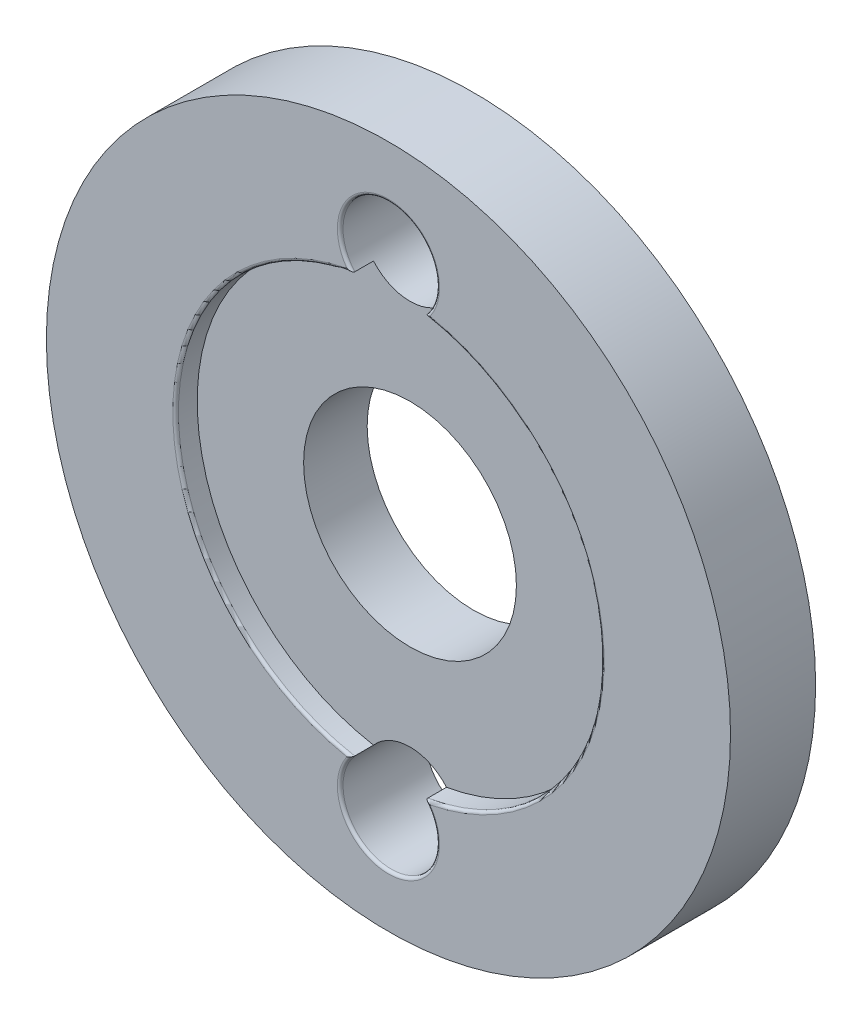
ISO-10303-21;
HEADER;
FILE_DESCRIPTION(('STEP AP214'),'2;1');
FILE_NAME('part.step','',(''),(''),'','','');
FILE_SCHEMA(('AUTOMOTIVE_DESIGN { 1 0 10303 214 1 1 1 1 }'));
ENDSEC;
DATA;
#1=APPLICATION_CONTEXT('core data for automotive mechanical design processes');
#2=APPLICATION_PROTOCOL_DEFINITION('international standard','automotive_design',2000,#1);
#3=PRODUCT_CONTEXT('',#1,'mechanical');
#4=PRODUCT('Part','Part','',(#3));
#5=PRODUCT_RELATED_PRODUCT_CATEGORY('part','',(#4));
#6=PRODUCT_DEFINITION_FORMATION('','',#4);
#7=PRODUCT_DEFINITION_CONTEXT('part definition',#1,'design');
#8=PRODUCT_DEFINITION('design','',#6,#7);
#9=PRODUCT_DEFINITION_SHAPE('','',#8);
#10=(LENGTH_UNIT() NAMED_UNIT(*) SI_UNIT(.MILLI.,.METRE.));
#11=(NAMED_UNIT(*) PLANE_ANGLE_UNIT() SI_UNIT($,.RADIAN.));
#12=(NAMED_UNIT(*) SI_UNIT($,.STERADIAN.) SOLID_ANGLE_UNIT());
#13=UNCERTAINTY_MEASURE_WITH_UNIT(LENGTH_MEASURE(1.E-05),#10,'distance_accuracy_value','');
#14=(GEOMETRIC_REPRESENTATION_CONTEXT(3) GLOBAL_UNCERTAINTY_ASSIGNED_CONTEXT((#13)) GLOBAL_UNIT_ASSIGNED_CONTEXT((#10,
#11,#12)) REPRESENTATION_CONTEXT('',''));
#15=CARTESIAN_POINT('',(0.,0.,0.));
#16=DIRECTION('',(0.,0.,1.));
#17=DIRECTION('',(1.,0.,0.));
#18=AXIS2_PLACEMENT_3D('',#15,#16,#17);
#19=CARTESIAN_POINT('',(0.,8.49999999999995,2.24));
#20=DIRECTION('',(0.,0.,-1.));
#21=DIRECTION('',(-1.,0.,0.));
#22=AXIS2_PLACEMENT_3D('',#19,#20,#21);
#23=CYLINDRICAL_SURFACE('',#22,1.7);
#24=CARTESIAN_POINT('',(0.,8.49999999999995,0.));
#25=DIRECTION('',(0.,0.,1.));
#26=DIRECTION('',(1.,0.,0.));
#27=AXIS2_PLACEMENT_3D('',#24,#25,#26);
#28=CIRCLE('',#27,1.7);
#29=CARTESIAN_POINT('',(1.7,8.49999999999995,0.));
#30=VERTEX_POINT('',#29);
#31=EDGE_CURVE('E133',#30,#30,#28,.T.);
#32=ORIENTED_EDGE('',*,*,#31,.F.);
#33=EDGE_LOOP('',(#32));
#34=FACE_BOUND('',#33,.T.);
#35=DIRECTION('',(0.,0.,-1.));
#36=VECTOR('',#35,1.);
#37=CARTESIAN_POINT('',(1.2865795160856,7.38882352941173,3.));
#38=LINE('',#37,#36);
#39=CARTESIAN_POINT('',(1.2865795160856,7.38882352941173,2.9));
#40=VERTEX_POINT('',#39);
#41=CARTESIAN_POINT('',(1.2865795160856,7.38882352941173,2.24));
#42=VERTEX_POINT('',#41);
#43=EDGE_CURVE('E123',#40,#42,#38,.T.);
#44=ORIENTED_EDGE('',*,*,#43,.F.);
#45=CARTESIAN_POINT('',(0.,8.49999999999995,2.9));
#46=DIRECTION('',(0.,0.,1.));
#47=DIRECTION('',(1.,0.,0.));
#48=AXIS2_PLACEMENT_3D('',#45,#46,#47);
#49=CIRCLE('',#48,1.7);
#50=CARTESIAN_POINT('',(-1.28657951608561,7.38882352941173,2.9));
#51=VERTEX_POINT('',#50);
#52=EDGE_CURVE('E11',#40,#51,#49,.T.);
#53=ORIENTED_EDGE('',*,*,#52,.T.);
#54=DIRECTION('',(0.,0.,-1.));
#55=VECTOR('',#54,1.);
#56=CARTESIAN_POINT('',(-1.28657951608561,7.38882352941173,3.));
#57=LINE('',#56,#55);
#58=CARTESIAN_POINT('',(-1.28657951608561,7.38882352941173,2.24));
#59=VERTEX_POINT('',#58);
#60=EDGE_CURVE('E98',#51,#59,#57,.T.);
#61=ORIENTED_EDGE('',*,*,#60,.T.);
#62=CARTESIAN_POINT('',(0.,8.49999999999995,2.24));
#63=DIRECTION('',(0.,0.,1.));
#64=DIRECTION('',(1.,0.,0.));
#65=AXIS2_PLACEMENT_3D('',#62,#63,#64);
#66=CIRCLE('',#65,1.7);
#67=EDGE_CURVE('E100',#59,#42,#66,.T.);
#68=ORIENTED_EDGE('',*,*,#67,.T.);
#69=EDGE_LOOP('',(#44,#53,#61,#68));
#70=FACE_BOUND('',#69,.T.);
#71=ADVANCED_FACE('F39',(#34,#70),#23,.F.);
#72=CARTESIAN_POINT('',(0.,-8.49999999999995,2.24));
#73=DIRECTION('',(0.,0.,-1.));
#74=DIRECTION('',(-1.,0.,0.));
#75=AXIS2_PLACEMENT_3D('',#72,#73,#74);
#76=CYLINDRICAL_SURFACE('',#75,1.7);
#77=CARTESIAN_POINT('',(0.,-8.49999999999995,0.));
#78=DIRECTION('',(0.,0.,1.));
#79=DIRECTION('',(1.,0.,0.));
#80=AXIS2_PLACEMENT_3D('',#77,#78,#79);
#81=CIRCLE('',#80,1.7);
#82=CARTESIAN_POINT('',(1.7,-8.49999999999995,0.));
#83=VERTEX_POINT('',#82);
#84=EDGE_CURVE('E125',#83,#83,#81,.T.);
#85=ORIENTED_EDGE('',*,*,#84,.F.);
#86=EDGE_LOOP('',(#85));
#87=FACE_BOUND('',#86,.T.);
#88=DIRECTION('',(0.,0.,-1.));
#89=VECTOR('',#88,1.);
#90=CARTESIAN_POINT('',(-1.28657951608561,-7.38882352941173,3.));
#91=LINE('',#90,#89);
#92=CARTESIAN_POINT('',(-1.28657951608561,-7.38882352941173,2.9));
#93=VERTEX_POINT('',#92);
#94=CARTESIAN_POINT('',(-1.28657951608561,-7.38882352941173,2.24));
#95=VERTEX_POINT('',#94);
#96=EDGE_CURVE('E105',#93,#95,#91,.T.);
#97=ORIENTED_EDGE('',*,*,#96,.F.);
#98=CARTESIAN_POINT('',(0.,-8.49999999999995,2.9));
#99=DIRECTION('',(0.,0.,1.));
#100=DIRECTION('',(1.,0.,0.));
#101=AXIS2_PLACEMENT_3D('',#98,#99,#100);
#102=CIRCLE('',#101,1.7);
#103=CARTESIAN_POINT('',(1.2865795160856,-7.38882352941173,2.9));
#104=VERTEX_POINT('',#103);
#105=EDGE_CURVE('E134',#93,#104,#102,.T.);
#106=ORIENTED_EDGE('',*,*,#105,.T.);
#107=DIRECTION('',(0.,0.,-1.));
#108=VECTOR('',#107,1.);
#109=CARTESIAN_POINT('',(1.2865795160856,-7.38882352941173,3.));
#110=LINE('',#109,#108);
#111=CARTESIAN_POINT('',(1.2865795160856,-7.38882352941173,2.24));
#112=VERTEX_POINT('',#111);
#113=EDGE_CURVE('E230',#104,#112,#110,.T.);
#114=ORIENTED_EDGE('',*,*,#113,.T.);
#115=CARTESIAN_POINT('',(0.,-8.49999999999995,2.24));
#116=DIRECTION('',(0.,0.,1.));
#117=DIRECTION('',(1.,0.,0.));
#118=AXIS2_PLACEMENT_3D('',#115,#116,#117);
#119=CIRCLE('',#118,1.7);
#120=EDGE_CURVE('E115',#112,#95,#119,.T.);
#121=ORIENTED_EDGE('',*,*,#120,.T.);
#122=EDGE_LOOP('',(#97,#106,#114,#121));
#123=FACE_BOUND('',#122,.T.);
#124=ADVANCED_FACE('F190',(#87,#123),#76,.F.);
#125=CARTESIAN_POINT('',(0.,0.,2.24));
#126=DIRECTION('',(0.,0.,-1.));
#127=DIRECTION('',(-1.,0.,0.));
#128=AXIS2_PLACEMENT_3D('',#125,#126,#127);
#129=CYLINDRICAL_SURFACE('',#128,3.75);
#130=CARTESIAN_POINT('',(0.,0.,2.24));
#131=DIRECTION('',(0.,0.,1.));
#132=DIRECTION('',(1.,0.,0.));
#133=AXIS2_PLACEMENT_3D('',#130,#131,#132);
#134=CIRCLE('',#133,3.75);
#135=CARTESIAN_POINT('',(3.75,0.,2.24));
#136=VERTEX_POINT('',#135);
#137=EDGE_CURVE('E128',#136,#136,#134,.T.);
#138=ORIENTED_EDGE('',*,*,#137,.T.);
#139=EDGE_LOOP('',(#138));
#140=FACE_BOUND('',#139,.T.);
#141=CARTESIAN_POINT('',(0.,0.,0.));
#142=DIRECTION('',(0.,0.,1.));
#143=DIRECTION('',(1.,0.,0.));
#144=AXIS2_PLACEMENT_3D('',#141,#142,#143);
#145=CIRCLE('',#144,3.75);
#146=CARTESIAN_POINT('',(3.75,0.,0.));
#147=VERTEX_POINT('',#146);
#148=EDGE_CURVE('E118',#147,#147,#145,.T.);
#149=ORIENTED_EDGE('',*,*,#148,.F.);
#150=EDGE_LOOP('',(#149));
#151=FACE_BOUND('',#150,.T.);
#152=ADVANCED_FACE('F194',(#140,#151),#129,.F.);
#153=CARTESIAN_POINT('',(0.,0.,2.24));
#154=DIRECTION('',(0.,0.,1.));
#155=DIRECTION('',(1.,0.,0.));
#156=AXIS2_PLACEMENT_3D('',#153,#154,#155);
#157=PLANE('',#156);
#158=ORIENTED_EDGE('',*,*,#67,.F.);
#159=CARTESIAN_POINT('',(0.,0.,2.24));
#160=DIRECTION('',(0.,0.,1.));
#161=DIRECTION('',(1.,0.,0.));
#162=AXIS2_PLACEMENT_3D('',#159,#160,#161);
#163=CIRCLE('',#162,7.5);
#164=EDGE_CURVE('E106',#59,#95,#163,.T.);
#165=ORIENTED_EDGE('',*,*,#164,.T.);
#166=ORIENTED_EDGE('',*,*,#120,.F.);
#167=CARTESIAN_POINT('',(0.,0.,2.24));
#168=DIRECTION('',(0.,0.,1.));
#169=DIRECTION('',(1.,0.,0.));
#170=AXIS2_PLACEMENT_3D('',#167,#168,#169);
#171=CIRCLE('',#170,7.5);
#172=EDGE_CURVE('E117',#112,#42,#171,.T.);
#173=ORIENTED_EDGE('',*,*,#172,.T.);
#174=EDGE_LOOP('',(#158,#165,#166,#173));
#175=FACE_BOUND('',#174,.T.);
#176=ORIENTED_EDGE('',*,*,#137,.F.);
#177=EDGE_LOOP('',(#176));
#178=FACE_BOUND('',#177,.T.);
#179=ADVANCED_FACE('F114',(#175,#178),#157,.T.);
#180=CARTESIAN_POINT('',(0.,0.,0.));
#181=DIRECTION('',(0.,0.,1.));
#182=DIRECTION('',(1.,0.,0.));
#183=AXIS2_PLACEMENT_3D('',#180,#181,#182);
#184=PLANE('',#183);
#185=ORIENTED_EDGE('',*,*,#84,.T.);
#186=EDGE_LOOP('',(#185));
#187=FACE_BOUND('',#186,.T.);
#188=ORIENTED_EDGE('',*,*,#31,.T.);
#189=EDGE_LOOP('',(#188));
#190=FACE_BOUND('',#189,.T.);
#191=ORIENTED_EDGE('',*,*,#148,.T.);
#192=EDGE_LOOP('',(#191));
#193=FACE_BOUND('',#192,.T.);
#194=CARTESIAN_POINT('',(0.,0.,0.));
#195=DIRECTION('',(0.,0.,1.));
#196=DIRECTION('',(1.,0.,0.));
#197=AXIS2_PLACEMENT_3D('',#194,#195,#196);
#198=CIRCLE('',#197,12.0555555555556);
#199=CARTESIAN_POINT('',(12.0555555555556,0.,0.));
#200=VERTEX_POINT('',#199);
#201=EDGE_CURVE('E221',#200,#200,#198,.T.);
#202=ORIENTED_EDGE('',*,*,#201,.F.);
#203=EDGE_LOOP('',(#202));
#204=FACE_BOUND('',#203,.T.);
#205=ADVANCED_FACE('F202',(#187,#190,#193,#204),#184,.F.);
#206=CARTESIAN_POINT('',(0.,0.,3.));
#207=DIRECTION('',(0.,0.,-1.));
#208=DIRECTION('',(-1.,0.,0.));
#209=AXIS2_PLACEMENT_3D('',#206,#207,#208);
#210=CYLINDRICAL_SURFACE('',#209,7.5);
#211=ORIENTED_EDGE('',*,*,#113,.F.);
#212=CARTESIAN_POINT('',(0.,0.,2.9));
#213=DIRECTION('',(0.,0.,1.));
#214=DIRECTION('',(1.,0.,0.));
#215=AXIS2_PLACEMENT_3D('',#212,#213,#214);
#216=CIRCLE('',#215,7.5);
#217=EDGE_CURVE('E67',#104,#40,#216,.T.);
#218=ORIENTED_EDGE('',*,*,#217,.T.);
#219=ORIENTED_EDGE('',*,*,#43,.T.);
#220=ORIENTED_EDGE('',*,*,#172,.F.);
#221=EDGE_LOOP('',(#211,#218,#219,#220));
#222=FACE_BOUND('',#221,.T.);
#223=ADVANCED_FACE('F201',(#222),#210,.F.);
#224=CARTESIAN_POINT('',(0.,0.,3.));
#225=DIRECTION('',(0.,0.,-1.));
#226=DIRECTION('',(-1.,0.,0.));
#227=AXIS2_PLACEMENT_3D('',#224,#225,#226);
#228=CYLINDRICAL_SURFACE('',#227,7.5);
#229=ORIENTED_EDGE('',*,*,#60,.F.);
#230=CARTESIAN_POINT('',(0.,0.,2.9));
#231=DIRECTION('',(0.,0.,1.));
#232=DIRECTION('',(1.,0.,0.));
#233=AXIS2_PLACEMENT_3D('',#230,#231,#232);
#234=CIRCLE('',#233,7.5);
#235=EDGE_CURVE('E52',#51,#93,#234,.T.);
#236=ORIENTED_EDGE('',*,*,#235,.T.);
#237=ORIENTED_EDGE('',*,*,#96,.T.);
#238=ORIENTED_EDGE('',*,*,#164,.F.);
#239=EDGE_LOOP('',(#229,#236,#237,#238));
#240=FACE_BOUND('',#239,.T.);
#241=ADVANCED_FACE('F110',(#240),#228,.F.);
#242=CARTESIAN_POINT('',(0.,0.,3.));
#243=DIRECTION('',(0.,0.,-1.));
#244=DIRECTION('',(-1.,0.,0.));
#245=AXIS2_PLACEMENT_3D('',#242,#243,#244);
#246=CYLINDRICAL_SURFACE('',#245,12.0555555555556);
#247=CARTESIAN_POINT('',(0.,0.,3.));
#248=DIRECTION('',(0.,0.,1.));
#249=DIRECTION('',(1.,0.,0.));
#250=AXIS2_PLACEMENT_3D('',#247,#248,#249);
#251=CIRCLE('',#250,12.0555555555556);
#252=CARTESIAN_POINT('',(12.0555555555556,0.,3.));
#253=VERTEX_POINT('',#252);
#254=EDGE_CURVE('E101',#253,#253,#251,.T.);
#255=ORIENTED_EDGE('',*,*,#254,.F.);
#256=EDGE_LOOP('',(#255));
#257=FACE_BOUND('',#256,.T.);
#258=ORIENTED_EDGE('',*,*,#201,.T.);
#259=EDGE_LOOP('',(#258));
#260=FACE_BOUND('',#259,.T.);
#261=ADVANCED_FACE('F215',(#257,#260),#246,.T.);
#262=CARTESIAN_POINT('',(0.,0.,3.));
#263=DIRECTION('',(0.,0.,1.));
#264=DIRECTION('',(1.,0.,0.));
#265=AXIS2_PLACEMENT_3D('',#262,#263,#264);
#266=PLANE('',#265);
#267=CARTESIAN_POINT('',(0.,0.,3.));
#268=DIRECTION('',(0.,0.,1.));
#269=DIRECTION('',(1.,0.,0.));
#270=AXIS2_PLACEMENT_3D('',#267,#268,#269);
#271=CIRCLE('',#270,7.6);
#272=CARTESIAN_POINT('',(1.46706295107682,7.45705882352941,3.));
#273=VERTEX_POINT('',#272);
#274=CARTESIAN_POINT('',(1.46706295107682,-7.45705882352941,3.));
#275=VERTEX_POINT('',#274);
#276=EDGE_CURVE('E143',#273,#275,#271,.F.);
#277=ORIENTED_EDGE('',*,*,#276,.T.);
#278=CARTESIAN_POINT('',(0.,-8.49999999999995,3.));
#279=DIRECTION('',(0.,0.,1.));
#280=DIRECTION('',(1.,0.,0.));
#281=AXIS2_PLACEMENT_3D('',#278,#279,#280);
#282=CIRCLE('',#281,1.8);
#283=CARTESIAN_POINT('',(-1.46706295107682,-7.45705882352941,3.));
#284=VERTEX_POINT('',#283);
#285=EDGE_CURVE('E150',#275,#284,#282,.F.);
#286=ORIENTED_EDGE('',*,*,#285,.T.);
#287=CARTESIAN_POINT('',(0.,0.,3.));
#288=DIRECTION('',(0.,0.,1.));
#289=DIRECTION('',(1.,0.,0.));
#290=AXIS2_PLACEMENT_3D('',#287,#288,#289);
#291=CIRCLE('',#290,7.6);
#292=CARTESIAN_POINT('',(-1.46706295107682,7.45705882352941,3.));
#293=VERTEX_POINT('',#292);
#294=EDGE_CURVE('E141',#284,#293,#291,.F.);
#295=ORIENTED_EDGE('',*,*,#294,.T.);
#296=CARTESIAN_POINT('',(0.,8.49999999999995,3.));
#297=DIRECTION('',(0.,0.,1.));
#298=DIRECTION('',(1.,0.,0.));
#299=AXIS2_PLACEMENT_3D('',#296,#297,#298);
#300=CIRCLE('',#299,1.8);
#301=EDGE_CURVE('E142',#293,#273,#300,.F.);
#302=ORIENTED_EDGE('',*,*,#301,.T.);
#303=EDGE_LOOP('',(#277,#286,#295,#302));
#304=FACE_BOUND('',#303,.T.);
#305=ORIENTED_EDGE('',*,*,#254,.T.);
#306=EDGE_LOOP('',(#305));
#307=FACE_BOUND('',#306,.T.);
#308=ADVANCED_FACE('F182',(#304,#307),#266,.T.);
#309=CARTESIAN_POINT('',(0.,8.49999999999995,2.9));
#310=DIRECTION('',(0.,0.,1.));
#311=DIRECTION('',(1.,0.,0.));
#312=AXIS2_PLACEMENT_3D('',#309,#310,#311);
#313=TOROIDAL_SURFACE('',#312,1.8,0.1);
#314=CARTESIAN_POINT('',(1.2865795160856,7.38882352941173,2.9));
#315=CARTESIAN_POINT('',(1.2865722478109,7.38882101073423,2.90300601737434));
#316=CARTESIAN_POINT('',(1.28683813033269,7.38891588501241,2.90600208814084));
#317=CARTESIAN_POINT('',(1.28784901852166,7.38927704802362,2.91186858284192));
#318=CARTESIAN_POINT('',(1.28858865139565,7.38954141457951,2.91474003495817));
#319=CARTESIAN_POINT('',(1.29071081504286,7.39030080717254,2.92099473053056));
#320=CARTESIAN_POINT('',(1.29220536468455,7.39083608156191,2.92433441973545));
#321=CARTESIAN_POINT('',(1.29568285572294,7.39208404773597,2.93072366163288));
#322=CARTESIAN_POINT('',(1.29766806644611,7.39279756406575,2.93377177223216));
#323=CARTESIAN_POINT('',(1.30321802898447,7.39479703878518,2.94120796731616));
#324=CARTESIAN_POINT('',(1.30704027636285,7.39617822616492,2.94537625860141));
#325=CARTESIAN_POINT('',(1.31521200733767,7.3991438587857,2.95306283163932));
#326=CARTESIAN_POINT('',(1.31956254804725,7.40072871194295,2.95657977333959));
#327=CARTESIAN_POINT('',(1.33240903780689,7.40543013080672,2.96581243298425));
#328=CARTESIAN_POINT('',(1.34130662077675,7.40871121329905,2.97088096049281));
#329=CARTESIAN_POINT('',(1.35965717795092,7.4155392377367,2.97963349391931));
#330=CARTESIAN_POINT('',(1.36911174063501,7.41908694889988,2.98331329393468));
#331=CARTESIAN_POINT('',(1.39275306977143,7.4280381141369,2.99095430750387));
#332=CARTESIAN_POINT('',(1.40711205973698,7.4335430921597,2.99426319503694));
#333=CARTESIAN_POINT('',(1.43603097862961,7.44477437930924,2.99873251623359));
#334=CARTESIAN_POINT('',(1.45059040021619,7.45050017879138,2.99989762633334));
#335=CARTESIAN_POINT('',(1.46576564472318,7.45654190320692,2.99999783019244));
#336=CARTESIAN_POINT('',(1.46641433736875,7.4568003085033,2.99999998146507));
#337=CARTESIAN_POINT('',(1.46706295107682,7.45705882352941,3.));
#338=B_SPLINE_CURVE_WITH_KNOTS('',3,(#314,#315,#316,#317,#318,#319,#320,#321,#322,#323,#324,
#325,#326,#327,#328,#329,#330,#331,#332,#333,#334,#335,#336,#337),.UNSPECIFIED.,.F.,.F.,(4,2,2,
2,2,2,2,2,2,2,2,4),(0.,0.00898873733830296,0.017877296307194,0.0289092116665769,
0.0399931375066646,0.0573596817000385,0.0747615673613322,0.106839992852644,0.139014805993194,
0.186022444623465,0.232927418663058,0.235022212448232),.UNSPECIFIED.);
#339=EDGE_CURVE('E234',#273,#40,#338,.F.);
#340=ORIENTED_EDGE('',*,*,#339,.F.);
#341=ORIENTED_EDGE('',*,*,#301,.F.);
#342=CARTESIAN_POINT('',(-1.28657951608561,7.38882352941173,2.9));
#343=CARTESIAN_POINT('',(-1.28657224781091,7.38882101073423,2.90300601737434));
#344=CARTESIAN_POINT('',(-1.2868381303327,7.38891588501241,2.90600208814084));
#345=CARTESIAN_POINT('',(-1.28784901852167,7.38927704802362,2.91186858284192));
#346=CARTESIAN_POINT('',(-1.28858865139565,7.3895414145795,2.91474003495817));
#347=CARTESIAN_POINT('',(-1.29071081504286,7.39030080717254,2.92099473053056));
#348=CARTESIAN_POINT('',(-1.29220536468455,7.3908360815619,2.92433441973545));
#349=CARTESIAN_POINT('',(-1.29568285572294,7.39208404773596,2.93072366163288));
#350=CARTESIAN_POINT('',(-1.29766806644612,7.39279756406575,2.93377177223216));
#351=CARTESIAN_POINT('',(-1.30321802898448,7.39479703878518,2.94120796731616));
#352=CARTESIAN_POINT('',(-1.30704027636286,7.39617822616492,2.94537625860141));
#353=CARTESIAN_POINT('',(-1.31521200733768,7.3991438587857,2.95306283163931));
#354=CARTESIAN_POINT('',(-1.31956254804725,7.40072871194295,2.95657977333959));
#355=CARTESIAN_POINT('',(-1.33240903780689,7.40543013080672,2.96581243298425));
#356=CARTESIAN_POINT('',(-1.34130662077676,7.40871121329905,2.97088096049281));
#357=CARTESIAN_POINT('',(-1.35965717795093,7.4155392377367,2.97963349391931));
#358=CARTESIAN_POINT('',(-1.36911174063501,7.41908694889988,2.98331329393468));
#359=CARTESIAN_POINT('',(-1.39275306977144,7.4280381141369,2.99095430750387));
#360=CARTESIAN_POINT('',(-1.40711205973699,7.4335430921597,2.99426319503694));
#361=CARTESIAN_POINT('',(-1.43603097862961,7.44477437930924,2.99873251623359));
#362=CARTESIAN_POINT('',(-1.4505904002162,7.45050017879138,2.99989762633334));
#363=CARTESIAN_POINT('',(-1.46576564472318,7.45654190320692,2.99999783019244));
#364=CARTESIAN_POINT('',(-1.46641433736876,7.4568003085033,2.99999998146507));
#365=CARTESIAN_POINT('',(-1.46706295107682,7.45705882352941,3.));
#366=B_SPLINE_CURVE_WITH_KNOTS('',3,(#342,#343,#344,#345,#346,#347,#348,#349,#350,#351,#352,
#353,#354,#355,#356,#357,#358,#359,#360,#361,#362,#363,#364,#365),.UNSPECIFIED.,.F.,.F.,(4,2,2,
2,2,2,2,2,2,2,2,4),(0.,0.00898873733830336,0.0178772963071937,0.0289092116665761,
0.0399931375066643,0.0573596817000382,0.0747615673613323,0.106839992852644,0.139014805993194,
0.186022444623465,0.232927418663057,0.235022212448231),.UNSPECIFIED.);
#367=EDGE_CURVE('E42',#51,#293,#366,.T.);
#368=ORIENTED_EDGE('',*,*,#367,.F.);
#369=ORIENTED_EDGE('',*,*,#52,.F.);
#370=EDGE_LOOP('',(#340,#341,#368,#369));
#371=FACE_BOUND('',#370,.T.);
#372=ADVANCED_FACE('F41',(#371),#313,.T.);
#373=CARTESIAN_POINT('',(0.,0.,2.9));
#374=DIRECTION('',(0.,0.,1.));
#375=DIRECTION('',(1.,0.,0.));
#376=AXIS2_PLACEMENT_3D('',#373,#374,#375);
#377=TOROIDAL_SURFACE('',#376,7.6,0.1);
#378=ORIENTED_EDGE('',*,*,#367,.T.);
#379=ORIENTED_EDGE('',*,*,#294,.F.);
#380=CARTESIAN_POINT('',(-1.28657951608561,-7.38882352941173,2.9));
#381=CARTESIAN_POINT('',(-1.2865722478109,-7.38882101073423,2.90300601737434));
#382=CARTESIAN_POINT('',(-1.28683813033269,-7.38891588501241,2.90600208814084));
#383=CARTESIAN_POINT('',(-1.28784901852166,-7.38927704802362,2.91186858284192));
#384=CARTESIAN_POINT('',(-1.28858865139565,-7.38954141457951,2.91474003495817));
#385=CARTESIAN_POINT('',(-1.29071081504286,-7.39030080717254,2.92099473053056));
#386=CARTESIAN_POINT('',(-1.29220536468455,-7.39083608156191,2.92433441973545));
#387=CARTESIAN_POINT('',(-1.29568285572294,-7.39208404773597,2.93072366163288));
#388=CARTESIAN_POINT('',(-1.29766806644612,-7.39279756406575,2.93377177223216));
#389=CARTESIAN_POINT('',(-1.30321802898447,-7.39479703878518,2.94120796731616));
#390=CARTESIAN_POINT('',(-1.30704027636285,-7.39617822616492,2.94537625860141));
#391=CARTESIAN_POINT('',(-1.31521200733767,-7.3991438587857,2.95306283163932));
#392=CARTESIAN_POINT('',(-1.31956254804725,-7.40072871194295,2.95657977333959));
#393=CARTESIAN_POINT('',(-1.33240903780689,-7.40543013080672,2.96581243298425));
#394=CARTESIAN_POINT('',(-1.34130662077675,-7.40871121329905,2.97088096049281));
#395=CARTESIAN_POINT('',(-1.35965717795092,-7.4155392377367,2.97963349391931));
#396=CARTESIAN_POINT('',(-1.36911174063501,-7.41908694889988,2.98331329393468));
#397=CARTESIAN_POINT('',(-1.39275306977143,-7.4280381141369,2.99095430750387));
#398=CARTESIAN_POINT('',(-1.40711205973698,-7.4335430921597,2.99426319503694));
#399=CARTESIAN_POINT('',(-1.43603097862961,-7.44477437930925,2.99873251623359));
#400=CARTESIAN_POINT('',(-1.45059040021619,-7.45050017879138,2.99989762633334));
#401=CARTESIAN_POINT('',(-1.46576564472318,-7.45654190320692,2.99999783019244));
#402=CARTESIAN_POINT('',(-1.46641433736875,-7.4568003085033,2.99999998146507));
#403=CARTESIAN_POINT('',(-1.46706295107682,-7.45705882352941,3.));
#404=B_SPLINE_CURVE_WITH_KNOTS('',3,(#380,#381,#382,#383,#384,#385,#386,#387,#388,#389,#390,
#391,#392,#393,#394,#395,#396,#397,#398,#399,#400,#401,#402,#403),.UNSPECIFIED.,.F.,.F.,(4,2,2,
2,2,2,2,2,2,2,2,4),(0.,0.00898873733830274,0.0178772963071935,0.0289092116665758,
0.0399931375066647,0.0573596817000384,0.0747615673613318,0.106839992852643,0.139014805993194,
0.186022444623464,0.232927418663056,0.235022212448231),.UNSPECIFIED.);
#405=EDGE_CURVE('E158',#93,#284,#404,.T.);
#406=ORIENTED_EDGE('',*,*,#405,.F.);
#407=ORIENTED_EDGE('',*,*,#235,.F.);
#408=EDGE_LOOP('',(#378,#379,#406,#407));
#409=FACE_BOUND('',#408,.T.);
#410=ADVANCED_FACE('F175',(#409),#377,.T.);
#411=CARTESIAN_POINT('',(0.,0.,2.9));
#412=DIRECTION('',(0.,0.,1.));
#413=DIRECTION('',(1.,0.,0.));
#414=AXIS2_PLACEMENT_3D('',#411,#412,#413);
#415=TOROIDAL_SURFACE('',#414,7.6,0.1);
#416=ORIENTED_EDGE('',*,*,#339,.T.);
#417=ORIENTED_EDGE('',*,*,#217,.F.);
#418=CARTESIAN_POINT('',(1.2865795160856,-7.38882352941173,2.9));
#419=CARTESIAN_POINT('',(1.2865722478109,-7.38882101073423,2.90300601737434));
#420=CARTESIAN_POINT('',(1.2868381303327,-7.38891588501241,2.90600208814084));
#421=CARTESIAN_POINT('',(1.28784901852167,-7.38927704802362,2.91186858284192));
#422=CARTESIAN_POINT('',(1.28858865139565,-7.38954141457951,2.91474003495817));
#423=CARTESIAN_POINT('',(1.29071081504286,-7.39030080717254,2.92099473053056));
#424=CARTESIAN_POINT('',(1.29220536468455,-7.3908360815619,2.92433441973545));
#425=CARTESIAN_POINT('',(1.29568285572294,-7.39208404773596,2.93072366163288));
#426=CARTESIAN_POINT('',(1.29766806644612,-7.39279756406575,2.93377177223216));
#427=CARTESIAN_POINT('',(1.30321802898447,-7.39479703878518,2.94120796731616));
#428=CARTESIAN_POINT('',(1.30704027636286,-7.39617822616492,2.94537625860141));
#429=CARTESIAN_POINT('',(1.31521200733768,-7.3991438587857,2.95306283163932));
#430=CARTESIAN_POINT('',(1.31956254804725,-7.40072871194295,2.95657977333959));
#431=CARTESIAN_POINT('',(1.33240903780689,-7.40543013080672,2.96581243298425));
#432=CARTESIAN_POINT('',(1.34130662077676,-7.40871121329905,2.97088096049281));
#433=CARTESIAN_POINT('',(1.35965717795092,-7.4155392377367,2.97963349391931));
#434=CARTESIAN_POINT('',(1.36911174063501,-7.41908694889988,2.98331329393468));
#435=CARTESIAN_POINT('',(1.39275306977144,-7.4280381141369,2.99095430750387));
#436=CARTESIAN_POINT('',(1.40711205973699,-7.4335430921597,2.99426319503694));
#437=CARTESIAN_POINT('',(1.43603097862961,-7.44477437930924,2.99873251623359));
#438=CARTESIAN_POINT('',(1.45059040021619,-7.45050017879138,2.99989762633334));
#439=CARTESIAN_POINT('',(1.46576564472318,-7.45654190320692,2.99999783019244));
#440=CARTESIAN_POINT('',(1.46641433736876,-7.4568003085033,2.99999998146507));
#441=CARTESIAN_POINT('',(1.46706295107682,-7.45705882352941,3.));
#442=B_SPLINE_CURVE_WITH_KNOTS('',3,(#418,#419,#420,#421,#422,#423,#424,#425,#426,#427,#428,
#429,#430,#431,#432,#433,#434,#435,#436,#437,#438,#439,#440,#441),.UNSPECIFIED.,.F.,.F.,(4,2,2,
2,2,2,2,2,2,2,2,4),(0.,0.00898873733830285,0.0178772963071942,0.0289092116665762,
0.039993137506665,0.0573596817000386,0.0747615673613328,0.106839992852644,0.139014805993194,
0.186022444623464,0.232927418663057,0.23502221244823),.UNSPECIFIED.);
#443=EDGE_CURVE('E152',#275,#104,#442,.F.);
#444=ORIENTED_EDGE('',*,*,#443,.F.);
#445=ORIENTED_EDGE('',*,*,#276,.F.);
#446=EDGE_LOOP('',(#416,#417,#444,#445));
#447=FACE_BOUND('',#446,.T.);
#448=ADVANCED_FACE('F164',(#447),#415,.T.);
#449=CARTESIAN_POINT('',(0.,-8.49999999999995,2.9));
#450=DIRECTION('',(0.,0.,1.));
#451=DIRECTION('',(1.,0.,0.));
#452=AXIS2_PLACEMENT_3D('',#449,#450,#451);
#453=TOROIDAL_SURFACE('',#452,1.8,0.1);
#454=ORIENTED_EDGE('',*,*,#405,.T.);
#455=ORIENTED_EDGE('',*,*,#285,.F.);
#456=ORIENTED_EDGE('',*,*,#443,.T.);
#457=ORIENTED_EDGE('',*,*,#105,.F.);
#458=EDGE_LOOP('',(#454,#455,#456,#457));
#459=FACE_BOUND('',#458,.T.);
#460=ADVANCED_FACE('F166',(#459),#453,.T.);
#461=CLOSED_SHELL('',(#71,#124,#152,#179,#205,#223,#241,#261,#308,#372,#410,#448,#460));
#462=MANIFOLD_SOLID_BREP('B2',#461);
#463=ADVANCED_BREP_SHAPE_REPRESENTATION('',(#18,#462),#14);
#464=SHAPE_DEFINITION_REPRESENTATION(#9,#463);
ENDSEC;
END-ISO-10303-21;
